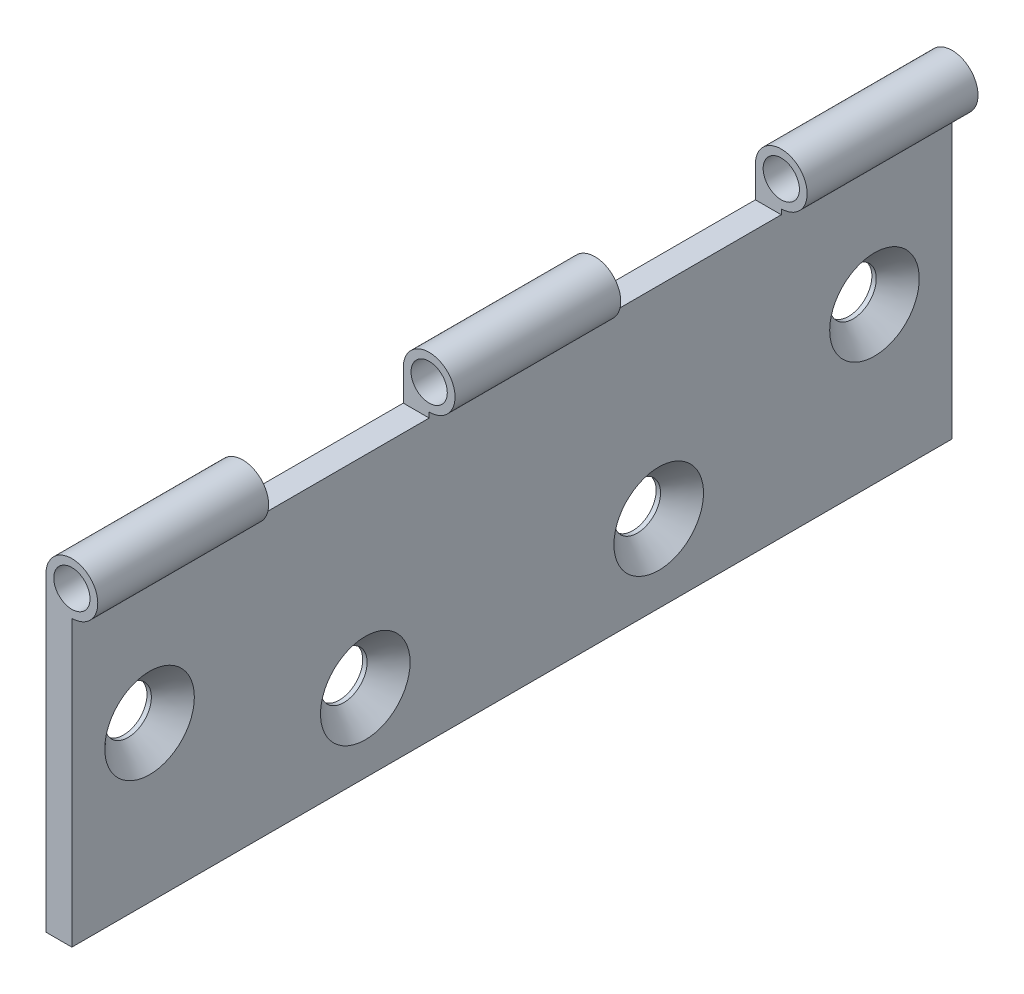
ISO-10303-21;
HEADER;
FILE_DESCRIPTION(('STEP AP214'),'2;1');
FILE_NAME('part.step','',(''),(''),'','','');
FILE_SCHEMA(('AUTOMOTIVE_DESIGN { 1 0 10303 214 1 1 1 1 }'));
ENDSEC;
DATA;
#1=APPLICATION_CONTEXT('core data for automotive mechanical design processes');
#2=APPLICATION_PROTOCOL_DEFINITION('international standard','automotive_design',2000,#1);
#3=PRODUCT_CONTEXT('',#1,'mechanical');
#4=PRODUCT('Part','Part','',(#3));
#5=PRODUCT_RELATED_PRODUCT_CATEGORY('part','',(#4));
#6=PRODUCT_DEFINITION_FORMATION('','',#4);
#7=PRODUCT_DEFINITION_CONTEXT('part definition',#1,'design');
#8=PRODUCT_DEFINITION('design','',#6,#7);
#9=PRODUCT_DEFINITION_SHAPE('','',#8);
#10=(LENGTH_UNIT() NAMED_UNIT(*) SI_UNIT(.MILLI.,.METRE.));
#11=(NAMED_UNIT(*) PLANE_ANGLE_UNIT() SI_UNIT($,.RADIAN.));
#12=(NAMED_UNIT(*) SI_UNIT($,.STERADIAN.) SOLID_ANGLE_UNIT());
#13=UNCERTAINTY_MEASURE_WITH_UNIT(LENGTH_MEASURE(1.E-05),#10,'distance_accuracy_value','');
#14=(GEOMETRIC_REPRESENTATION_CONTEXT(3) GLOBAL_UNCERTAINTY_ASSIGNED_CONTEXT((#13)) GLOBAL_UNIT_ASSIGNED_CONTEXT((#10,
#11,#12)) REPRESENTATION_CONTEXT('',''));
#15=CARTESIAN_POINT('',(0.,0.,0.));
#16=DIRECTION('',(0.,0.,1.));
#17=DIRECTION('',(1.,0.,0.));
#18=AXIS2_PLACEMENT_3D('',#15,#16,#17);
#19=CARTESIAN_POINT('',(5.,60.,-85.));
#20=DIRECTION('',(0.,0.,1.));
#21=DIRECTION('',(1.,0.,0.));
#22=AXIS2_PLACEMENT_3D('',#19,#20,#21);
#23=CYLINDRICAL_SURFACE('',#22,5.);
#24=CARTESIAN_POINT('',(5.,60.,-16.));
#25=DIRECTION('',(0.,0.,1.));
#26=DIRECTION('',(0.,-1.,0.));
#27=AXIS2_PLACEMENT_3D('',#24,#25,#26);
#28=CIRCLE('',#27,5.);
#29=CARTESIAN_POINT('',(0.,60.,-16.));
#30=VERTEX_POINT('',#29);
#31=CARTESIAN_POINT('',(5.,55.,-16.));
#32=VERTEX_POINT('',#31);
#33=EDGE_CURVE('E121',#30,#32,#28,.F.);
#34=ORIENTED_EDGE('',*,*,#33,.F.);
#35=DIRECTION('',(0.,0.,-1.));
#36=VECTOR('',#35,1.);
#37=CARTESIAN_POINT('',(0.,60.,85.));
#38=LINE('',#37,#36);
#39=CARTESIAN_POINT('',(0.,60.,16.));
#40=VERTEX_POINT('',#39);
#41=EDGE_CURVE('E42',#40,#30,#38,.T.);
#42=ORIENTED_EDGE('',*,*,#41,.F.);
#43=CARTESIAN_POINT('',(5.,60.,16.));
#44=DIRECTION('',(0.,0.,-1.));
#45=DIRECTION('',(0.,1.,0.));
#46=AXIS2_PLACEMENT_3D('',#43,#44,#45);
#47=CIRCLE('',#46,5.);
#48=CARTESIAN_POINT('',(5.,55.,16.));
#49=VERTEX_POINT('',#48);
#50=EDGE_CURVE('E108',#49,#40,#47,.F.);
#51=ORIENTED_EDGE('',*,*,#50,.F.);
#52=DIRECTION('',(0.,0.,1.));
#53=VECTOR('',#52,1.);
#54=CARTESIAN_POINT('',(5.,55.,-85.));
#55=LINE('',#54,#53);
#56=EDGE_CURVE('E219',#32,#49,#55,.T.);
#57=ORIENTED_EDGE('',*,*,#56,.F.);
#58=EDGE_LOOP('',(#34,#42,#51,#57));
#59=FACE_BOUND('',#58,.T.);
#60=ADVANCED_FACE('F33',(#59),#23,.T.);
#61=CARTESIAN_POINT('',(5.,60.,-85.));
#62=DIRECTION('',(0.,0.,1.));
#63=DIRECTION('',(1.,0.,0.));
#64=AXIS2_PLACEMENT_3D('',#61,#62,#63);
#65=CYLINDRICAL_SURFACE('',#64,3.5);
#66=CARTESIAN_POINT('',(5.,60.,-52.));
#67=DIRECTION('',(0.,0.,-1.));
#68=DIRECTION('',(0.,1.,0.));
#69=AXIS2_PLACEMENT_3D('',#66,#67,#68);
#70=CIRCLE('',#69,3.5);
#71=CARTESIAN_POINT('',(5.,63.5,-52.));
#72=VERTEX_POINT('',#71);
#73=EDGE_CURVE('E37',#72,#72,#70,.F.);
#74=ORIENTED_EDGE('',*,*,#73,.T.);
#75=EDGE_LOOP('',(#74));
#76=FACE_BOUND('',#75,.T.);
#77=CARTESIAN_POINT('',(5.,60.,-85.));
#78=DIRECTION('',(0.,0.,1.));
#79=DIRECTION('',(1.,0.,0.));
#80=AXIS2_PLACEMENT_3D('',#77,#78,#79);
#81=CIRCLE('',#80,3.5);
#82=CARTESIAN_POINT('',(8.5,60.,-85.));
#83=VERTEX_POINT('',#82);
#84=EDGE_CURVE('E209',#83,#83,#81,.T.);
#85=ORIENTED_EDGE('',*,*,#84,.F.);
#86=EDGE_LOOP('',(#85));
#87=FACE_BOUND('',#86,.T.);
#88=ADVANCED_FACE('F306',(#76,#87),#65,.F.);
#89=CARTESIAN_POINT('',(5.,60.,-52.));
#90=DIRECTION('',(0.,0.,-1.));
#91=DIRECTION('',(0.,1.,0.));
#92=AXIS2_PLACEMENT_3D('',#89,#90,#91);
#93=CIRCLE('',#92,5.);
#94=CARTESIAN_POINT('',(5.,55.,-52.));
#95=VERTEX_POINT('',#94);
#96=CARTESIAN_POINT('',(0.,60.,-52.));
#97=VERTEX_POINT('',#96);
#98=EDGE_CURVE('E140',#95,#97,#93,.F.);
#99=ORIENTED_EDGE('',*,*,#98,.F.);
#100=CARTESIAN_POINT('',(5.,55.,-85.));
#101=VERTEX_POINT('',#100);
#102=EDGE_CURVE('E95',#101,#95,#55,.T.);
#103=ORIENTED_EDGE('',*,*,#102,.F.);
#104=CARTESIAN_POINT('',(5.,60.,-85.));
#105=DIRECTION('',(0.,0.,1.));
#106=DIRECTION('',(1.,0.,0.));
#107=AXIS2_PLACEMENT_3D('',#104,#105,#106);
#108=CIRCLE('',#107,5.);
#109=CARTESIAN_POINT('',(0.,60.,-85.));
#110=VERTEX_POINT('',#109);
#111=EDGE_CURVE('E93',#101,#110,#108,.T.);
#112=ORIENTED_EDGE('',*,*,#111,.T.);
#113=EDGE_CURVE('E44',#97,#110,#38,.T.);
#114=ORIENTED_EDGE('',*,*,#113,.F.);
#115=EDGE_LOOP('',(#99,#103,#112,#114));
#116=FACE_BOUND('',#115,.T.);
#117=ADVANCED_FACE('F299',(#116),#23,.T.);
#118=CARTESIAN_POINT('',(5.,60.,52.));
#119=DIRECTION('',(0.,0.,1.));
#120=DIRECTION('',(0.,-1.,0.));
#121=AXIS2_PLACEMENT_3D('',#118,#119,#120);
#122=CIRCLE('',#121,3.5);
#123=CARTESIAN_POINT('',(5.,56.5,52.));
#124=VERTEX_POINT('',#123);
#125=EDGE_CURVE('E110',#124,#124,#122,.F.);
#126=ORIENTED_EDGE('',*,*,#125,.T.);
#127=EDGE_LOOP('',(#126));
#128=FACE_BOUND('',#127,.T.);
#129=CARTESIAN_POINT('',(5.,60.,85.));
#130=DIRECTION('',(0.,0.,1.));
#131=DIRECTION('',(1.,0.,0.));
#132=AXIS2_PLACEMENT_3D('',#129,#130,#131);
#133=CIRCLE('',#132,3.5);
#134=CARTESIAN_POINT('',(8.5,60.,85.));
#135=VERTEX_POINT('',#134);
#136=EDGE_CURVE('E208',#135,#135,#133,.T.);
#137=ORIENTED_EDGE('',*,*,#136,.T.);
#138=EDGE_LOOP('',(#137));
#139=FACE_BOUND('',#138,.T.);
#140=ADVANCED_FACE('F307',(#128,#139),#65,.F.);
#141=CARTESIAN_POINT('',(5.,0.,85.));
#142=DIRECTION('',(-1.,0.,0.));
#143=DIRECTION('',(0.,0.,1.));
#144=AXIS2_PLACEMENT_3D('',#141,#142,#143);
#145=PLANE('',#144);
#146=CARTESIAN_POINT('',(5.,15.,-28.3333333333333));
#147=DIRECTION('',(-1.,0.,0.));
#148=DIRECTION('',(0.,0.,1.));
#149=AXIS2_PLACEMENT_3D('',#146,#147,#148);
#150=CIRCLE('',#149,8.65);
#151=CARTESIAN_POINT('',(5.,15.,-19.6833333333333));
#152=VERTEX_POINT('',#151);
#153=EDGE_CURVE('E172',#152,#152,#150,.T.);
#154=ORIENTED_EDGE('',*,*,#153,.T.);
#155=EDGE_LOOP('',(#154));
#156=FACE_BOUND('',#155,.T.);
#157=CARTESIAN_POINT('',(5.,30.,-70.));
#158=DIRECTION('',(-1.,0.,0.));
#159=DIRECTION('',(0.,0.,1.));
#160=AXIS2_PLACEMENT_3D('',#157,#158,#159);
#161=CIRCLE('',#160,8.65);
#162=CARTESIAN_POINT('',(5.,30.,-61.35));
#163=VERTEX_POINT('',#162);
#164=EDGE_CURVE('E181',#163,#163,#161,.T.);
#165=ORIENTED_EDGE('',*,*,#164,.T.);
#166=EDGE_LOOP('',(#165));
#167=FACE_BOUND('',#166,.T.);
#168=CARTESIAN_POINT('',(5.,30.,70.));
#169=DIRECTION('',(1.,0.,0.));
#170=DIRECTION('',(0.,0.,-1.));
#171=AXIS2_PLACEMENT_3D('',#168,#169,#170);
#172=CIRCLE('',#171,8.65);
#173=CARTESIAN_POINT('',(5.,30.,61.35));
#174=VERTEX_POINT('',#173);
#175=EDGE_CURVE('E190',#174,#174,#172,.T.);
#176=ORIENTED_EDGE('',*,*,#175,.F.);
#177=EDGE_LOOP('',(#176));
#178=FACE_BOUND('',#177,.T.);
#179=CARTESIAN_POINT('',(5.,15.,28.3333333333333));
#180=DIRECTION('',(1.,0.,0.));
#181=DIRECTION('',(0.,0.,-1.));
#182=AXIS2_PLACEMENT_3D('',#179,#180,#181);
#183=CIRCLE('',#182,8.65);
#184=CARTESIAN_POINT('',(5.,15.,19.6833333333333));
#185=VERTEX_POINT('',#184);
#186=EDGE_CURVE('E199',#185,#185,#183,.T.);
#187=ORIENTED_EDGE('',*,*,#186,.F.);
#188=EDGE_LOOP('',(#187));
#189=FACE_BOUND('',#188,.T.);
#190=ORIENTED_EDGE('',*,*,#102,.T.);
#191=DIRECTION('',(0.,-1.,0.));
#192=VECTOR('',#191,1.);
#193=CARTESIAN_POINT('',(5.,0.,-52.));
#194=LINE('',#193,#192);
#195=CARTESIAN_POINT('',(5.,54.,-52.));
#196=VERTEX_POINT('',#195);
#197=EDGE_CURVE('E138',#95,#196,#194,.T.);
#198=ORIENTED_EDGE('',*,*,#197,.T.);
#199=DIRECTION('',(0.,0.,1.));
#200=VECTOR('',#199,1.);
#201=CARTESIAN_POINT('',(5.,54.,85.));
#202=LINE('',#201,#200);
#203=CARTESIAN_POINT('',(5.,54.,-16.));
#204=VERTEX_POINT('',#203);
#205=EDGE_CURVE('E143',#196,#204,#202,.T.);
#206=ORIENTED_EDGE('',*,*,#205,.T.);
#207=DIRECTION('',(0.,1.,0.));
#208=VECTOR('',#207,1.);
#209=CARTESIAN_POINT('',(5.,0.,-16.));
#210=LINE('',#209,#208);
#211=EDGE_CURVE('E116',#204,#32,#210,.T.);
#212=ORIENTED_EDGE('',*,*,#211,.T.);
#213=ORIENTED_EDGE('',*,*,#56,.T.);
#214=DIRECTION('',(0.,-1.,0.));
#215=VECTOR('',#214,1.);
#216=CARTESIAN_POINT('',(5.,0.,16.));
#217=LINE('',#216,#215);
#218=CARTESIAN_POINT('',(5.,54.,16.));
#219=VERTEX_POINT('',#218);
#220=EDGE_CURVE('E113',#49,#219,#217,.T.);
#221=ORIENTED_EDGE('',*,*,#220,.T.);
#222=DIRECTION('',(0.,0.,1.));
#223=VECTOR('',#222,1.);
#224=CARTESIAN_POINT('',(5.,54.,85.));
#225=LINE('',#224,#223);
#226=CARTESIAN_POINT('',(5.,54.,52.));
#227=VERTEX_POINT('',#226);
#228=EDGE_CURVE('E169',#219,#227,#225,.T.);
#229=ORIENTED_EDGE('',*,*,#228,.T.);
#230=DIRECTION('',(0.,1.,0.));
#231=VECTOR('',#230,1.);
#232=CARTESIAN_POINT('',(5.,0.,52.));
#233=LINE('',#232,#231);
#234=CARTESIAN_POINT('',(5.,55.,52.));
#235=VERTEX_POINT('',#234);
#236=EDGE_CURVE('E166',#227,#235,#233,.T.);
#237=ORIENTED_EDGE('',*,*,#236,.T.);
#238=CARTESIAN_POINT('',(5.,55.,85.));
#239=VERTEX_POINT('',#238);
#240=EDGE_CURVE('E216',#235,#239,#55,.T.);
#241=ORIENTED_EDGE('',*,*,#240,.T.);
#242=DIRECTION('',(0.,1.,0.));
#243=VECTOR('',#242,1.);
#244=CARTESIAN_POINT('',(5.,0.,85.));
#245=LINE('',#244,#243);
#246=CARTESIAN_POINT('',(5.,0.,85.));
#247=VERTEX_POINT('',#246);
#248=EDGE_CURVE('E81',#247,#239,#245,.T.);
#249=ORIENTED_EDGE('',*,*,#248,.F.);
#250=DIRECTION('',(0.,0.,-1.));
#251=VECTOR('',#250,1.);
#252=CARTESIAN_POINT('',(5.,0.,85.));
#253=LINE('',#252,#251);
#254=CARTESIAN_POINT('',(5.,0.,-85.));
#255=VERTEX_POINT('',#254);
#256=EDGE_CURVE('E60',#247,#255,#253,.T.);
#257=ORIENTED_EDGE('',*,*,#256,.T.);
#258=DIRECTION('',(0.,1.,0.));
#259=VECTOR('',#258,1.);
#260=CARTESIAN_POINT('',(5.,0.,-85.));
#261=LINE('',#260,#259);
#262=EDGE_CURVE('E78',#255,#101,#261,.T.);
#263=ORIENTED_EDGE('',*,*,#262,.T.);
#264=EDGE_LOOP('',(#190,#198,#206,#212,#213,#221,#229,#237,#241,#249,#257,#263));
#265=FACE_BOUND('',#264,.T.);
#266=ADVANCED_FACE('F35',(#156,#167,#178,#189,#265),#145,.F.);
#267=CARTESIAN_POINT('',(0.,0.,85.));
#268=DIRECTION('',(-1.,0.,0.));
#269=DIRECTION('',(0.,0.,1.));
#270=AXIS2_PLACEMENT_3D('',#267,#268,#269);
#271=PLANE('',#270);
#272=DIRECTION('',(0.,1.,0.));
#273=VECTOR('',#272,1.);
#274=CARTESIAN_POINT('',(0.,54.,-52.));
#275=LINE('',#274,#273);
#276=CARTESIAN_POINT('',(0.,54.,-52.));
#277=VERTEX_POINT('',#276);
#278=EDGE_CURVE('E131',#277,#97,#275,.T.);
#279=ORIENTED_EDGE('',*,*,#278,.T.);
#280=ORIENTED_EDGE('',*,*,#113,.T.);
#281=DIRECTION('',(0.,1.,0.));
#282=VECTOR('',#281,1.);
#283=CARTESIAN_POINT('',(0.,0.,-85.));
#284=LINE('',#283,#282);
#285=CARTESIAN_POINT('',(0.,0.,-85.));
#286=VERTEX_POINT('',#285);
#287=EDGE_CURVE('E94',#286,#110,#284,.T.);
#288=ORIENTED_EDGE('',*,*,#287,.F.);
#289=DIRECTION('',(0.,0.,-1.));
#290=VECTOR('',#289,1.);
#291=CARTESIAN_POINT('',(0.,0.,85.));
#292=LINE('',#291,#290);
#293=CARTESIAN_POINT('',(0.,0.,85.));
#294=VERTEX_POINT('',#293);
#295=EDGE_CURVE('E83',#294,#286,#292,.T.);
#296=ORIENTED_EDGE('',*,*,#295,.F.);
#297=DIRECTION('',(0.,1.,0.));
#298=VECTOR('',#297,1.);
#299=CARTESIAN_POINT('',(0.,0.,85.));
#300=LINE('',#299,#298);
#301=CARTESIAN_POINT('',(0.,60.,85.));
#302=VERTEX_POINT('',#301);
#303=EDGE_CURVE('E100',#294,#302,#300,.T.);
#304=ORIENTED_EDGE('',*,*,#303,.T.);
#305=CARTESIAN_POINT('',(0.,60.,52.));
#306=VERTEX_POINT('',#305);
#307=EDGE_CURVE('E11',#302,#306,#38,.T.);
#308=ORIENTED_EDGE('',*,*,#307,.T.);
#309=DIRECTION('',(0.,-1.,0.));
#310=VECTOR('',#309,1.);
#311=CARTESIAN_POINT('',(0.,54.,52.));
#312=LINE('',#311,#310);
#313=CARTESIAN_POINT('',(0.,54.,52.));
#314=VERTEX_POINT('',#313);
#315=EDGE_CURVE('E146',#306,#314,#312,.T.);
#316=ORIENTED_EDGE('',*,*,#315,.T.);
#317=DIRECTION('',(0.,0.,-1.));
#318=VECTOR('',#317,1.);
#319=CARTESIAN_POINT('',(0.,54.,16.));
#320=LINE('',#319,#318);
#321=CARTESIAN_POINT('',(0.,54.,16.));
#322=VERTEX_POINT('',#321);
#323=EDGE_CURVE('E149',#314,#322,#320,.T.);
#324=ORIENTED_EDGE('',*,*,#323,.T.);
#325=DIRECTION('',(0.,1.,0.));
#326=VECTOR('',#325,1.);
#327=CARTESIAN_POINT('',(0.,65.,16.));
#328=LINE('',#327,#326);
#329=EDGE_CURVE('E152',#322,#40,#328,.T.);
#330=ORIENTED_EDGE('',*,*,#329,.T.);
#331=ORIENTED_EDGE('',*,*,#41,.T.);
#332=DIRECTION('',(0.,-1.,0.));
#333=VECTOR('',#332,1.);
#334=CARTESIAN_POINT('',(0.,65.,-16.));
#335=LINE('',#334,#333);
#336=CARTESIAN_POINT('',(0.,54.,-16.));
#337=VERTEX_POINT('',#336);
#338=EDGE_CURVE('E283',#30,#337,#335,.T.);
#339=ORIENTED_EDGE('',*,*,#338,.T.);
#340=DIRECTION('',(0.,0.,-1.));
#341=VECTOR('',#340,1.);
#342=CARTESIAN_POINT('',(0.,54.,-52.));
#343=LINE('',#342,#341);
#344=EDGE_CURVE('E51',#337,#277,#343,.T.);
#345=ORIENTED_EDGE('',*,*,#344,.T.);
#346=EDGE_LOOP('',(#279,#280,#288,#296,#304,#308,#316,#324,#330,#331,#339,#345));
#347=FACE_BOUND('',#346,.T.);
#348=CARTESIAN_POINT('',(0.,15.,-28.3333333333333));
#349=DIRECTION('',(-1.,0.,0.));
#350=DIRECTION('',(0.,0.,1.));
#351=AXIS2_PLACEMENT_3D('',#348,#349,#350);
#352=CIRCLE('',#351,4.5);
#353=CARTESIAN_POINT('',(0.,15.,-23.8333333333333));
#354=VERTEX_POINT('',#353);
#355=EDGE_CURVE('E175',#354,#354,#352,.T.);
#356=ORIENTED_EDGE('',*,*,#355,.F.);
#357=EDGE_LOOP('',(#356));
#358=FACE_BOUND('',#357,.T.);
#359=CARTESIAN_POINT('',(0.,30.,-70.));
#360=DIRECTION('',(-1.,0.,0.));
#361=DIRECTION('',(0.,0.,1.));
#362=AXIS2_PLACEMENT_3D('',#359,#360,#361);
#363=CIRCLE('',#362,4.5);
#364=CARTESIAN_POINT('',(0.,30.,-65.5));
#365=VERTEX_POINT('',#364);
#366=EDGE_CURVE('E184',#365,#365,#363,.T.);
#367=ORIENTED_EDGE('',*,*,#366,.F.);
#368=EDGE_LOOP('',(#367));
#369=FACE_BOUND('',#368,.T.);
#370=CARTESIAN_POINT('',(0.,30.,70.));
#371=DIRECTION('',(1.,0.,0.));
#372=DIRECTION('',(0.,0.,-1.));
#373=AXIS2_PLACEMENT_3D('',#370,#371,#372);
#374=CIRCLE('',#373,4.5);
#375=CARTESIAN_POINT('',(0.,30.,65.5));
#376=VERTEX_POINT('',#375);
#377=EDGE_CURVE('E196',#376,#376,#374,.T.);
#378=ORIENTED_EDGE('',*,*,#377,.T.);
#379=EDGE_LOOP('',(#378));
#380=FACE_BOUND('',#379,.T.);
#381=CARTESIAN_POINT('',(0.,15.,28.3333333333333));
#382=DIRECTION('',(1.,0.,0.));
#383=DIRECTION('',(0.,0.,-1.));
#384=AXIS2_PLACEMENT_3D('',#381,#382,#383);
#385=CIRCLE('',#384,4.5);
#386=CARTESIAN_POINT('',(0.,15.,23.8333333333333));
#387=VERTEX_POINT('',#386);
#388=EDGE_CURVE('E205',#387,#387,#385,.T.);
#389=ORIENTED_EDGE('',*,*,#388,.T.);
#390=EDGE_LOOP('',(#389));
#391=FACE_BOUND('',#390,.T.);
#392=ADVANCED_FACE('F230',(#347,#358,#369,#380,#391),#271,.T.);
#393=CARTESIAN_POINT('',(5.,0.,85.));
#394=DIRECTION('',(0.,-1.,0.));
#395=DIRECTION('',(0.,0.,-1.));
#396=AXIS2_PLACEMENT_3D('',#393,#394,#395);
#397=PLANE('',#396);
#398=DIRECTION('',(-1.,0.,0.));
#399=VECTOR('',#398,1.);
#400=CARTESIAN_POINT('',(5.,0.,-85.));
#401=LINE('',#400,#399);
#402=EDGE_CURVE('E91',#255,#286,#401,.T.);
#403=ORIENTED_EDGE('',*,*,#402,.F.);
#404=ORIENTED_EDGE('',*,*,#256,.F.);
#405=DIRECTION('',(-1.,0.,0.));
#406=VECTOR('',#405,1.);
#407=CARTESIAN_POINT('',(5.,0.,85.));
#408=LINE('',#407,#406);
#409=EDGE_CURVE('E84',#247,#294,#408,.T.);
#410=ORIENTED_EDGE('',*,*,#409,.T.);
#411=ORIENTED_EDGE('',*,*,#295,.T.);
#412=EDGE_LOOP('',(#403,#404,#410,#411));
#413=FACE_BOUND('',#412,.T.);
#414=ADVANCED_FACE('F97',(#413),#397,.T.);
#415=CARTESIAN_POINT('',(0.,0.,85.));
#416=DIRECTION('',(0.,0.,-1.));
#417=DIRECTION('',(-1.,0.,0.));
#418=AXIS2_PLACEMENT_3D('',#415,#416,#417);
#419=PLANE('',#418);
#420=ORIENTED_EDGE('',*,*,#136,.F.);
#421=EDGE_LOOP('',(#420));
#422=FACE_BOUND('',#421,.T.);
#423=ORIENTED_EDGE('',*,*,#248,.T.);
#424=CARTESIAN_POINT('',(5.,60.,85.));
#425=DIRECTION('',(0.,0.,1.));
#426=DIRECTION('',(1.,0.,0.));
#427=AXIS2_PLACEMENT_3D('',#424,#425,#426);
#428=CIRCLE('',#427,5.);
#429=EDGE_CURVE('E212',#239,#302,#428,.T.);
#430=ORIENTED_EDGE('',*,*,#429,.T.);
#431=ORIENTED_EDGE('',*,*,#303,.F.);
#432=ORIENTED_EDGE('',*,*,#409,.F.);
#433=EDGE_LOOP('',(#423,#430,#431,#432));
#434=FACE_BOUND('',#433,.T.);
#435=ADVANCED_FACE('F225',(#422,#434),#419,.F.);
#436=CARTESIAN_POINT('',(0.,0.,-85.));
#437=DIRECTION('',(0.,0.,-1.));
#438=DIRECTION('',(-1.,0.,0.));
#439=AXIS2_PLACEMENT_3D('',#436,#437,#438);
#440=PLANE('',#439);
#441=ORIENTED_EDGE('',*,*,#84,.T.);
#442=EDGE_LOOP('',(#441));
#443=FACE_BOUND('',#442,.T.);
#444=ORIENTED_EDGE('',*,*,#287,.T.);
#445=ORIENTED_EDGE('',*,*,#111,.F.);
#446=ORIENTED_EDGE('',*,*,#262,.F.);
#447=ORIENTED_EDGE('',*,*,#402,.T.);
#448=EDGE_LOOP('',(#444,#445,#446,#447));
#449=FACE_BOUND('',#448,.T.);
#450=ADVANCED_FACE('F90',(#443,#449),#440,.T.);
#451=CARTESIAN_POINT('',(5.,60.,52.));
#452=DIRECTION('',(0.,0.,1.));
#453=DIRECTION('',(0.,-1.,0.));
#454=AXIS2_PLACEMENT_3D('',#451,#452,#453);
#455=CIRCLE('',#454,5.);
#456=EDGE_CURVE('E112',#306,#235,#455,.F.);
#457=ORIENTED_EDGE('',*,*,#456,.F.);
#458=ORIENTED_EDGE('',*,*,#307,.F.);
#459=ORIENTED_EDGE('',*,*,#429,.F.);
#460=ORIENTED_EDGE('',*,*,#240,.F.);
#461=EDGE_LOOP('',(#457,#458,#459,#460));
#462=FACE_BOUND('',#461,.T.);
#463=ADVANCED_FACE('F295',(#462),#23,.T.);
#464=CARTESIAN_POINT('',(5.,60.,-16.));
#465=DIRECTION('',(0.,0.,1.));
#466=DIRECTION('',(0.,-1.,0.));
#467=AXIS2_PLACEMENT_3D('',#464,#465,#466);
#468=CIRCLE('',#467,3.5);
#469=CARTESIAN_POINT('',(5.,56.5,-16.));
#470=VERTEX_POINT('',#469);
#471=EDGE_CURVE('E114',#470,#470,#468,.F.);
#472=ORIENTED_EDGE('',*,*,#471,.T.);
#473=EDGE_LOOP('',(#472));
#474=FACE_BOUND('',#473,.T.);
#475=CARTESIAN_POINT('',(5.,60.,16.));
#476=DIRECTION('',(0.,0.,-1.));
#477=DIRECTION('',(0.,1.,0.));
#478=AXIS2_PLACEMENT_3D('',#475,#476,#477);
#479=CIRCLE('',#478,3.5);
#480=CARTESIAN_POINT('',(5.,63.5,16.));
#481=VERTEX_POINT('',#480);
#482=EDGE_CURVE('E105',#481,#481,#479,.F.);
#483=ORIENTED_EDGE('',*,*,#482,.T.);
#484=EDGE_LOOP('',(#483));
#485=FACE_BOUND('',#484,.T.);
#486=ADVANCED_FACE('F297',(#474,#485),#65,.F.);
#487=CARTESIAN_POINT('',(5.,15.,28.3333333333333));
#488=DIRECTION('',(1.,0.,0.));
#489=DIRECTION('',(0.,0.,-1.));
#490=AXIS2_PLACEMENT_3D('',#487,#488,#489);
#491=CYLINDRICAL_SURFACE('',#490,4.5);
#492=ORIENTED_EDGE('',*,*,#388,.F.);
#493=EDGE_LOOP('',(#492));
#494=FACE_BOUND('',#493,.T.);
#495=CARTESIAN_POINT('',(0.850000000000003,15.,28.3333333333333));
#496=DIRECTION('',(1.,0.,0.));
#497=DIRECTION('',(0.,0.,-1.));
#498=AXIS2_PLACEMENT_3D('',#495,#496,#497);
#499=CIRCLE('',#498,4.5);
#500=CARTESIAN_POINT('',(0.850000000000003,15.,23.8333333333333));
#501=VERTEX_POINT('',#500);
#502=EDGE_CURVE('E202',#501,#501,#499,.T.);
#503=ORIENTED_EDGE('',*,*,#502,.T.);
#504=EDGE_LOOP('',(#503));
#505=FACE_BOUND('',#504,.T.);
#506=ADVANCED_FACE('F304',(#494,#505),#491,.F.);
#507=CARTESIAN_POINT('',(5.,15.,28.3333333333333));
#508=DIRECTION('',(1.,0.,0.));
#509=DIRECTION('',(0.,0.,-1.));
#510=AXIS2_PLACEMENT_3D('',#507,#508,#509);
#511=CONICAL_SURFACE('',#510,8.65,0.785398163397448);
#512=ORIENTED_EDGE('',*,*,#502,.F.);
#513=EDGE_LOOP('',(#512));
#514=FACE_BOUND('',#513,.T.);
#515=ORIENTED_EDGE('',*,*,#186,.T.);
#516=EDGE_LOOP('',(#515));
#517=FACE_BOUND('',#516,.T.);
#518=ADVANCED_FACE('F327',(#514,#517),#511,.F.);
#519=CARTESIAN_POINT('',(5.,30.,70.));
#520=DIRECTION('',(1.,0.,0.));
#521=DIRECTION('',(0.,0.,-1.));
#522=AXIS2_PLACEMENT_3D('',#519,#520,#521);
#523=CYLINDRICAL_SURFACE('',#522,4.5);
#524=ORIENTED_EDGE('',*,*,#377,.F.);
#525=EDGE_LOOP('',(#524));
#526=FACE_BOUND('',#525,.T.);
#527=CARTESIAN_POINT('',(0.850000000000003,30.,70.));
#528=DIRECTION('',(1.,0.,0.));
#529=DIRECTION('',(0.,0.,-1.));
#530=AXIS2_PLACEMENT_3D('',#527,#528,#529);
#531=CIRCLE('',#530,4.5);
#532=CARTESIAN_POINT('',(0.850000000000003,30.,65.5));
#533=VERTEX_POINT('',#532);
#534=EDGE_CURVE('E193',#533,#533,#531,.T.);
#535=ORIENTED_EDGE('',*,*,#534,.T.);
#536=EDGE_LOOP('',(#535));
#537=FACE_BOUND('',#536,.T.);
#538=ADVANCED_FACE('F331',(#526,#537),#523,.F.);
#539=CARTESIAN_POINT('',(5.,30.,70.));
#540=DIRECTION('',(1.,0.,0.));
#541=DIRECTION('',(0.,0.,-1.));
#542=AXIS2_PLACEMENT_3D('',#539,#540,#541);
#543=CONICAL_SURFACE('',#542,8.65,0.785398163397449);
#544=ORIENTED_EDGE('',*,*,#534,.F.);
#545=EDGE_LOOP('',(#544));
#546=FACE_BOUND('',#545,.T.);
#547=ORIENTED_EDGE('',*,*,#175,.T.);
#548=EDGE_LOOP('',(#547));
#549=FACE_BOUND('',#548,.T.);
#550=ADVANCED_FACE('F335',(#546,#549),#543,.F.);
#551=CARTESIAN_POINT('',(5.,30.,-70.));
#552=DIRECTION('',(1.,0.,0.));
#553=DIRECTION('',(0.,0.,1.));
#554=AXIS2_PLACEMENT_3D('',#551,#552,#553);
#555=CYLINDRICAL_SURFACE('',#554,4.5);
#556=ORIENTED_EDGE('',*,*,#366,.T.);
#557=EDGE_LOOP('',(#556));
#558=FACE_BOUND('',#557,.T.);
#559=CARTESIAN_POINT('',(0.850000000000003,30.,-70.));
#560=DIRECTION('',(-1.,0.,0.));
#561=DIRECTION('',(0.,0.,1.));
#562=AXIS2_PLACEMENT_3D('',#559,#560,#561);
#563=CIRCLE('',#562,4.5);
#564=CARTESIAN_POINT('',(0.850000000000003,30.,-65.5));
#565=VERTEX_POINT('',#564);
#566=EDGE_CURVE('E187',#565,#565,#563,.T.);
#567=ORIENTED_EDGE('',*,*,#566,.F.);
#568=EDGE_LOOP('',(#567));
#569=FACE_BOUND('',#568,.T.);
#570=ADVANCED_FACE('F339',(#558,#569),#555,.F.);
#571=CARTESIAN_POINT('',(5.,30.,-70.));
#572=DIRECTION('',(1.,0.,0.));
#573=DIRECTION('',(0.,0.,1.));
#574=AXIS2_PLACEMENT_3D('',#571,#572,#573);
#575=CONICAL_SURFACE('',#574,8.65,0.785398163397449);
#576=ORIENTED_EDGE('',*,*,#566,.T.);
#577=EDGE_LOOP('',(#576));
#578=FACE_BOUND('',#577,.T.);
#579=ORIENTED_EDGE('',*,*,#164,.F.);
#580=EDGE_LOOP('',(#579));
#581=FACE_BOUND('',#580,.T.);
#582=ADVANCED_FACE('F343',(#578,#581),#575,.F.);
#583=CARTESIAN_POINT('',(5.,15.,-28.3333333333333));
#584=DIRECTION('',(1.,0.,0.));
#585=DIRECTION('',(0.,0.,1.));
#586=AXIS2_PLACEMENT_3D('',#583,#584,#585);
#587=CYLINDRICAL_SURFACE('',#586,4.5);
#588=ORIENTED_EDGE('',*,*,#355,.T.);
#589=EDGE_LOOP('',(#588));
#590=FACE_BOUND('',#589,.T.);
#591=CARTESIAN_POINT('',(0.850000000000003,15.,-28.3333333333333));
#592=DIRECTION('',(-1.,0.,0.));
#593=DIRECTION('',(0.,0.,1.));
#594=AXIS2_PLACEMENT_3D('',#591,#592,#593);
#595=CIRCLE('',#594,4.5);
#596=CARTESIAN_POINT('',(0.850000000000003,15.,-23.8333333333333));
#597=VERTEX_POINT('',#596);
#598=EDGE_CURVE('E178',#597,#597,#595,.T.);
#599=ORIENTED_EDGE('',*,*,#598,.F.);
#600=EDGE_LOOP('',(#599));
#601=FACE_BOUND('',#600,.T.);
#602=ADVANCED_FACE('F347',(#590,#601),#587,.F.);
#603=CARTESIAN_POINT('',(5.,15.,-28.3333333333333));
#604=DIRECTION('',(1.,0.,0.));
#605=DIRECTION('',(0.,0.,1.));
#606=AXIS2_PLACEMENT_3D('',#603,#604,#605);
#607=CONICAL_SURFACE('',#606,8.65,0.785398163397448);
#608=ORIENTED_EDGE('',*,*,#598,.T.);
#609=EDGE_LOOP('',(#608));
#610=FACE_BOUND('',#609,.T.);
#611=ORIENTED_EDGE('',*,*,#153,.F.);
#612=EDGE_LOOP('',(#611));
#613=FACE_BOUND('',#612,.T.);
#614=ADVANCED_FACE('F351',(#610,#613),#607,.F.);
#615=CARTESIAN_POINT('',(0.,54.,16.));
#616=DIRECTION('',(0.,-1.,0.));
#617=DIRECTION('',(0.,0.,-1.));
#618=AXIS2_PLACEMENT_3D('',#615,#616,#617);
#619=PLANE('',#618);
#620=DIRECTION('',(1.,0.,0.));
#621=VECTOR('',#620,1.);
#622=CARTESIAN_POINT('',(0.,54.,16.));
#623=LINE('',#622,#621);
#624=EDGE_CURVE('E109',#322,#219,#623,.T.);
#625=ORIENTED_EDGE('',*,*,#624,.F.);
#626=ORIENTED_EDGE('',*,*,#323,.F.);
#627=DIRECTION('',(1.,0.,0.));
#628=VECTOR('',#627,1.);
#629=CARTESIAN_POINT('',(0.,54.,52.));
#630=LINE('',#629,#628);
#631=EDGE_CURVE('E155',#314,#227,#630,.T.);
#632=ORIENTED_EDGE('',*,*,#631,.T.);
#633=ORIENTED_EDGE('',*,*,#228,.F.);
#634=EDGE_LOOP('',(#625,#626,#632,#633));
#635=FACE_BOUND('',#634,.T.);
#636=ADVANCED_FACE('F355',(#635),#619,.F.);
#637=CARTESIAN_POINT('',(0.,54.,52.));
#638=DIRECTION('',(0.,0.,1.));
#639=DIRECTION('',(0.,-1.,0.));
#640=AXIS2_PLACEMENT_3D('',#637,#638,#639);
#641=PLANE('',#640);
#642=ORIENTED_EDGE('',*,*,#125,.F.);
#643=EDGE_LOOP('',(#642));
#644=FACE_BOUND('',#643,.T.);
#645=ORIENTED_EDGE('',*,*,#631,.F.);
#646=ORIENTED_EDGE('',*,*,#315,.F.);
#647=ORIENTED_EDGE('',*,*,#456,.T.);
#648=ORIENTED_EDGE('',*,*,#236,.F.);
#649=EDGE_LOOP('',(#645,#646,#647,#648));
#650=FACE_BOUND('',#649,.T.);
#651=ADVANCED_FACE('F357',(#644,#650),#641,.F.);
#652=CARTESIAN_POINT('',(0.,65.,16.));
#653=DIRECTION('',(0.,0.,-1.));
#654=DIRECTION('',(0.,1.,0.));
#655=AXIS2_PLACEMENT_3D('',#652,#653,#654);
#656=PLANE('',#655);
#657=ORIENTED_EDGE('',*,*,#482,.F.);
#658=EDGE_LOOP('',(#657));
#659=FACE_BOUND('',#658,.T.);
#660=ORIENTED_EDGE('',*,*,#220,.F.);
#661=ORIENTED_EDGE('',*,*,#50,.T.);
#662=ORIENTED_EDGE('',*,*,#329,.F.);
#663=ORIENTED_EDGE('',*,*,#624,.T.);
#664=EDGE_LOOP('',(#660,#661,#662,#663));
#665=FACE_BOUND('',#664,.T.);
#666=ADVANCED_FACE('F360',(#659,#665),#656,.F.);
#667=CARTESIAN_POINT('',(0.,54.,-52.));
#668=DIRECTION('',(0.,-1.,0.));
#669=DIRECTION('',(0.,0.,-1.));
#670=AXIS2_PLACEMENT_3D('',#667,#668,#669);
#671=PLANE('',#670);
#672=DIRECTION('',(1.,0.,0.));
#673=VECTOR('',#672,1.);
#674=CARTESIAN_POINT('',(0.,54.,-52.));
#675=LINE('',#674,#673);
#676=EDGE_CURVE('E117',#277,#196,#675,.T.);
#677=ORIENTED_EDGE('',*,*,#676,.F.);
#678=ORIENTED_EDGE('',*,*,#344,.F.);
#679=DIRECTION('',(1.,0.,0.));
#680=VECTOR('',#679,1.);
#681=CARTESIAN_POINT('',(0.,54.,-16.));
#682=LINE('',#681,#680);
#683=EDGE_CURVE('E124',#337,#204,#682,.T.);
#684=ORIENTED_EDGE('',*,*,#683,.T.);
#685=ORIENTED_EDGE('',*,*,#205,.F.);
#686=EDGE_LOOP('',(#677,#678,#684,#685));
#687=FACE_BOUND('',#686,.T.);
#688=ADVANCED_FACE('F277',(#687),#671,.F.);
#689=CARTESIAN_POINT('',(0.,54.,-52.));
#690=DIRECTION('',(0.,0.,-1.));
#691=DIRECTION('',(0.,1.,0.));
#692=AXIS2_PLACEMENT_3D('',#689,#690,#691);
#693=PLANE('',#692);
#694=ORIENTED_EDGE('',*,*,#98,.T.);
#695=ORIENTED_EDGE('',*,*,#278,.F.);
#696=ORIENTED_EDGE('',*,*,#676,.T.);
#697=ORIENTED_EDGE('',*,*,#197,.F.);
#698=EDGE_LOOP('',(#694,#695,#696,#697));
#699=FACE_BOUND('',#698,.T.);
#700=ORIENTED_EDGE('',*,*,#73,.F.);
#701=EDGE_LOOP('',(#700));
#702=FACE_BOUND('',#701,.T.);
#703=ADVANCED_FACE('F278',(#699,#702),#693,.F.);
#704=CARTESIAN_POINT('',(0.,65.,-16.));
#705=DIRECTION('',(0.,0.,1.));
#706=DIRECTION('',(0.,-1.,0.));
#707=AXIS2_PLACEMENT_3D('',#704,#705,#706);
#708=PLANE('',#707);
#709=ORIENTED_EDGE('',*,*,#33,.T.);
#710=ORIENTED_EDGE('',*,*,#211,.F.);
#711=ORIENTED_EDGE('',*,*,#683,.F.);
#712=ORIENTED_EDGE('',*,*,#338,.F.);
#713=EDGE_LOOP('',(#709,#710,#711,#712));
#714=FACE_BOUND('',#713,.T.);
#715=ORIENTED_EDGE('',*,*,#471,.F.);
#716=EDGE_LOOP('',(#715));
#717=FACE_BOUND('',#716,.T.);
#718=ADVANCED_FACE('F288',(#714,#717),#708,.F.);
#719=CLOSED_SHELL('',(#60,#88,#117,#140,#266,#392,#414,#435,#450,#463,#486,#506,#518,#538,#550,
#570,#582,#602,#614,#636,#651,#666,#688,#703,#718));
#720=MANIFOLD_SOLID_BREP('B2',#719);
#721=ADVANCED_BREP_SHAPE_REPRESENTATION('',(#18,#720),#14);
#722=SHAPE_DEFINITION_REPRESENTATION(#9,#721);
ENDSEC;
END-ISO-10303-21;
